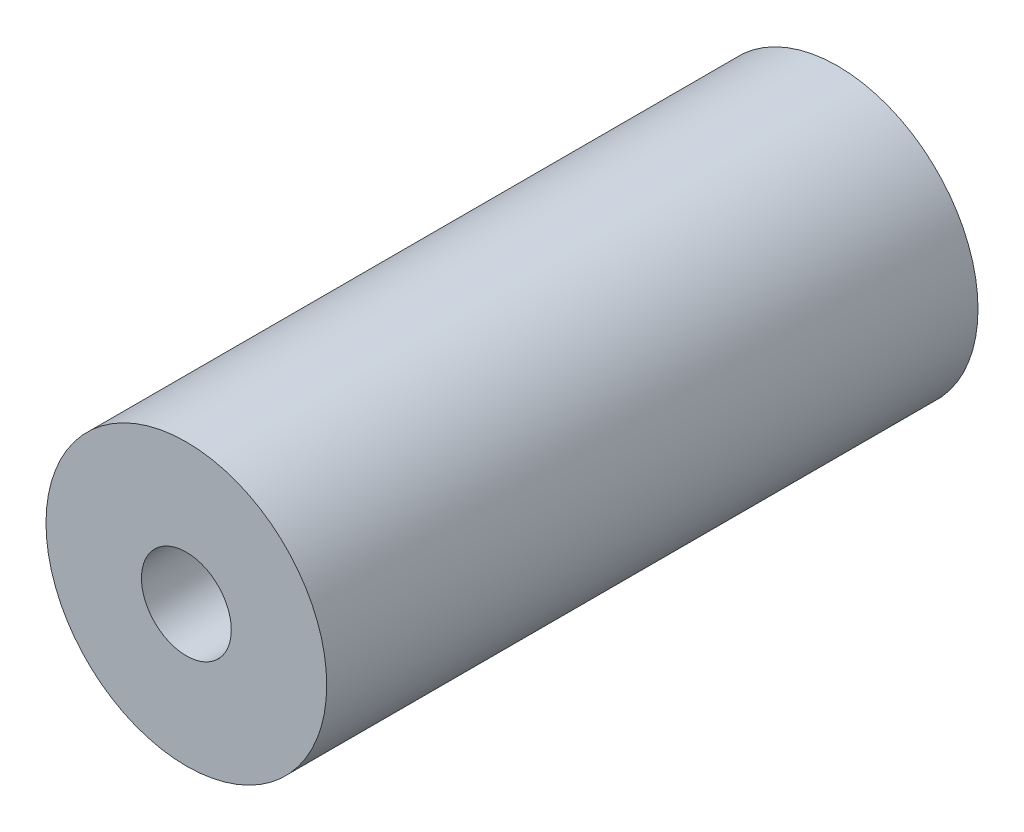
ISO-10303-21;
HEADER;
FILE_DESCRIPTION(('STEP AP214'),'2;1');
FILE_NAME('part.step','',(''),(''),'','','');
FILE_SCHEMA(('AUTOMOTIVE_DESIGN { 1 0 10303 214 1 1 1 1 }'));
ENDSEC;
DATA;
#1=APPLICATION_CONTEXT('core data for automotive mechanical design processes');
#2=APPLICATION_PROTOCOL_DEFINITION('international standard','automotive_design',2000,#1);
#3=PRODUCT_CONTEXT('',#1,'mechanical');
#4=PRODUCT('Part','Part','',(#3));
#5=PRODUCT_RELATED_PRODUCT_CATEGORY('part','',(#4));
#6=PRODUCT_DEFINITION_FORMATION('','',#4);
#7=PRODUCT_DEFINITION_CONTEXT('part definition',#1,'design');
#8=PRODUCT_DEFINITION('design','',#6,#7);
#9=PRODUCT_DEFINITION_SHAPE('','',#8);
#10=(LENGTH_UNIT() NAMED_UNIT(*) SI_UNIT(.MILLI.,.METRE.));
#11=(NAMED_UNIT(*) PLANE_ANGLE_UNIT() SI_UNIT($,.RADIAN.));
#12=(NAMED_UNIT(*) SI_UNIT($,.STERADIAN.) SOLID_ANGLE_UNIT());
#13=UNCERTAINTY_MEASURE_WITH_UNIT(LENGTH_MEASURE(1.E-05),#10,'distance_accuracy_value','');
#14=(GEOMETRIC_REPRESENTATION_CONTEXT(3) GLOBAL_UNCERTAINTY_ASSIGNED_CONTEXT((#13)) GLOBAL_UNIT_ASSIGNED_CONTEXT((#10,
#11,#12)) REPRESENTATION_CONTEXT('',''));
#15=CARTESIAN_POINT('',(0.,0.,0.));
#16=DIRECTION('',(0.,0.,1.));
#17=DIRECTION('',(1.,0.,0.));
#18=AXIS2_PLACEMENT_3D('',#15,#16,#17);
#19=CARTESIAN_POINT('',(0.,0.,-29.));
#20=DIRECTION('',(0.,0.,1.));
#21=DIRECTION('',(1.,0.,0.));
#22=AXIS2_PLACEMENT_3D('',#19,#20,#21);
#23=CYLINDRICAL_SURFACE('',#22,12.5);
#24=CARTESIAN_POINT('',(0.,0.,-29.));
#25=DIRECTION('',(0.,0.,1.));
#26=DIRECTION('',(1.,0.,0.));
#27=AXIS2_PLACEMENT_3D('',#24,#25,#26);
#28=CIRCLE('',#27,12.5);
#29=CARTESIAN_POINT('',(12.5,0.,-29.));
#30=VERTEX_POINT('',#29);
#31=EDGE_CURVE('E10',#30,#30,#28,.T.);
#32=CARTESIAN_POINT('',(0.,0.,29.));
#33=DIRECTION('',(0.,0.,1.));
#34=DIRECTION('',(1.,0.,0.));
#35=AXIS2_PLACEMENT_3D('',#32,#33,#34);
#36=CIRCLE('',#35,12.5);
#37=CARTESIAN_POINT('',(12.5,0.,29.));
#38=VERTEX_POINT('',#37);
#39=EDGE_CURVE('E46',#38,#38,#36,.T.);
#40=CARTESIAN_POINT('',(12.5,0.,-29.));
#41=CARTESIAN_POINT('',(12.5,0.,-28.3958333333333));
#42=CARTESIAN_POINT('',(12.5,0.,-27.7916666666667));
#43=CARTESIAN_POINT('',(12.5,0.,-26.5833333333333));
#44=CARTESIAN_POINT('',(12.5,0.,-25.9791666666667));
#45=CARTESIAN_POINT('',(12.5,0.,-24.7708333333333));
#46=CARTESIAN_POINT('',(12.5,0.,-24.1666666666667));
#47=CARTESIAN_POINT('',(12.5,0.,-22.9583333333333));
#48=CARTESIAN_POINT('',(12.5,0.,-22.3541666666667));
#49=CARTESIAN_POINT('',(12.5,0.,-21.1458333333333));
#50=CARTESIAN_POINT('',(12.5,0.,-20.5416666666667));
#51=CARTESIAN_POINT('',(12.5,0.,-19.3333333333333));
#52=CARTESIAN_POINT('',(12.5,0.,-18.7291666666667));
#53=CARTESIAN_POINT('',(12.5,0.,-17.5208333333333));
#54=CARTESIAN_POINT('',(12.5,0.,-16.9166666666667));
#55=CARTESIAN_POINT('',(12.5,0.,-15.7083333333333));
#56=CARTESIAN_POINT('',(12.5,0.,-15.1041666666667));
#57=CARTESIAN_POINT('',(12.5,0.,-13.8958333333333));
#58=CARTESIAN_POINT('',(12.5,0.,-13.2916666666667));
#59=CARTESIAN_POINT('',(12.5,0.,-12.0833333333333));
#60=CARTESIAN_POINT('',(12.5,0.,-11.4791666666667));
#61=CARTESIAN_POINT('',(12.5,0.,-10.2708333333333));
#62=CARTESIAN_POINT('',(12.5,0.,-9.66666666666667));
#63=CARTESIAN_POINT('',(12.5,0.,-8.45833333333333));
#64=CARTESIAN_POINT('',(12.5,0.,-7.85416666666667));
#65=CARTESIAN_POINT('',(12.5,0.,-6.64583333333333));
#66=CARTESIAN_POINT('',(12.5,0.,-6.04166666666667));
#67=CARTESIAN_POINT('',(12.5,0.,-4.83333333333333));
#68=CARTESIAN_POINT('',(12.5,0.,-4.22916666666667));
#69=CARTESIAN_POINT('',(12.5,0.,-3.02083333333333));
#70=CARTESIAN_POINT('',(12.5,0.,-2.41666666666667));
#71=CARTESIAN_POINT('',(12.5,0.,-1.20833333333333));
#72=CARTESIAN_POINT('',(12.5,0.,-0.604166666666667));
#73=CARTESIAN_POINT('',(12.5,0.,0.604166666666667));
#74=CARTESIAN_POINT('',(12.5,0.,1.20833333333333));
#75=CARTESIAN_POINT('',(12.5,0.,2.41666666666667));
#76=CARTESIAN_POINT('',(12.5,0.,3.02083333333333));
#77=CARTESIAN_POINT('',(12.5,0.,4.22916666666667));
#78=CARTESIAN_POINT('',(12.5,0.,4.83333333333333));
#79=CARTESIAN_POINT('',(12.5,0.,6.04166666666666));
#80=CARTESIAN_POINT('',(12.5,0.,6.64583333333333));
#81=CARTESIAN_POINT('',(12.5,0.,7.85416666666666));
#82=CARTESIAN_POINT('',(12.5,0.,8.45833333333333));
#83=CARTESIAN_POINT('',(12.5,0.,9.66666666666667));
#84=CARTESIAN_POINT('',(12.5,0.,10.2708333333333));
#85=CARTESIAN_POINT('',(12.5,0.,11.4791666666667));
#86=CARTESIAN_POINT('',(12.5,0.,12.0833333333333));
#87=CARTESIAN_POINT('',(12.5,0.,13.2916666666667));
#88=CARTESIAN_POINT('',(12.5,0.,13.8958333333333));
#89=CARTESIAN_POINT('',(12.5,0.,15.1041666666667));
#90=CARTESIAN_POINT('',(12.5,0.,15.7083333333333));
#91=CARTESIAN_POINT('',(12.5,0.,16.9166666666667));
#92=CARTESIAN_POINT('',(12.5,0.,17.5208333333333));
#93=CARTESIAN_POINT('',(12.5,0.,18.7291666666667));
#94=CARTESIAN_POINT('',(12.5,0.,19.3333333333333));
#95=CARTESIAN_POINT('',(12.5,0.,20.5416666666667));
#96=CARTESIAN_POINT('',(12.5,0.,21.1458333333333));
#97=CARTESIAN_POINT('',(12.5,0.,22.3541666666667));
#98=CARTESIAN_POINT('',(12.5,0.,22.9583333333333));
#99=CARTESIAN_POINT('',(12.5,0.,24.1666666666667));
#100=CARTESIAN_POINT('',(12.5,0.,24.7708333333333));
#101=CARTESIAN_POINT('',(12.5,0.,25.9791666666667));
#102=CARTESIAN_POINT('',(12.5,0.,26.5833333333333));
#103=CARTESIAN_POINT('',(12.5,0.,27.7916666666667));
#104=CARTESIAN_POINT('',(12.5,0.,28.3958333333333));
#105=CARTESIAN_POINT('',(12.5,0.,29.));
#106=B_SPLINE_CURVE_WITH_KNOTS('',3,(#40,#41,#42,#43,#44,#45,#46,#47,#48,#49,#50,#51,#52,#53,
#54,#55,#56,#57,#58,#59,#60,#61,#62,#63,#64,#65,#66,#67,#68,#69,#70,#71,#72,#73,#74,#75,#76,#77,
#78,#79,#80,#81,#82,#83,#84,#85,#86,#87,#88,#89,#90,#91,#92,#93,#94,#95,#96,#97,#98,#99,#100,
#101,#102,#103,#104,#105),.UNSPECIFIED.,.F.,.F.,(4,2,2,2,2,2,2,2,2,2,2,2,2,2,2,2,2,2,2,2,2,2,2,
2,2,2,2,2,2,2,2,2,4),(0.,1.8125,3.625,5.4375,7.25,9.0625,10.875,12.6875,14.5,16.3125,18.125,
19.9375,21.75,23.5625,25.375,27.1875,29.,30.8125,32.625,34.4375,36.25,38.0625,39.875,41.6875,
43.5,45.3125,47.125,48.9375,50.75,52.5625,54.375,56.1875,58.),.UNSPECIFIED.);
#107=EDGE_CURVE('BSEAM43',#30,#38,#106,.T.);
#108=ORIENTED_EDGE('',*,*,#31,.T.);
#109=ORIENTED_EDGE('',*,*,#39,.F.);
#110=ORIENTED_EDGE('',*,*,#107,.T.);
#111=ORIENTED_EDGE('',*,*,#107,.F.);
#112=EDGE_LOOP('',(#108,#110,#109,#111));
#113=FACE_BOUND('',#112,.T.);
#114=ADVANCED_FACE('F43',(#113),#23,.T.);
#115=CARTESIAN_POINT('',(0.,0.,-29.));
#116=DIRECTION('',(0.,0.,1.));
#117=DIRECTION('',(1.,0.,0.));
#118=AXIS2_PLACEMENT_3D('',#115,#116,#117);
#119=PLANE('',#118);
#120=CARTESIAN_POINT('',(0.,0.,-29.));
#121=DIRECTION('',(0.,0.,1.));
#122=DIRECTION('',(1.,0.,0.));
#123=AXIS2_PLACEMENT_3D('',#120,#121,#122);
#124=CIRCLE('',#123,4.);
#125=CARTESIAN_POINT('',(4.,0.,-29.));
#126=VERTEX_POINT('',#125);
#127=EDGE_CURVE('E55',#126,#126,#124,.T.);
#128=ORIENTED_EDGE('',*,*,#127,.T.);
#129=EDGE_LOOP('',(#128));
#130=FACE_BOUND('',#129,.T.);
#131=ORIENTED_EDGE('',*,*,#31,.F.);
#132=EDGE_LOOP('',(#131));
#133=FACE_BOUND('',#132,.T.);
#134=ADVANCED_FACE('F71',(#130,#133),#119,.F.);
#135=CARTESIAN_POINT('',(0.,0.,29.));
#136=DIRECTION('',(0.,0.,1.));
#137=DIRECTION('',(1.,0.,0.));
#138=AXIS2_PLACEMENT_3D('',#135,#136,#137);
#139=PLANE('',#138);
#140=CARTESIAN_POINT('',(0.,0.,29.));
#141=DIRECTION('',(0.,0.,1.));
#142=DIRECTION('',(1.,0.,0.));
#143=AXIS2_PLACEMENT_3D('',#140,#141,#142);
#144=CIRCLE('',#143,4.);
#145=CARTESIAN_POINT('',(4.,0.,29.));
#146=VERTEX_POINT('',#145);
#147=EDGE_CURVE('E60',#146,#146,#144,.T.);
#148=ORIENTED_EDGE('',*,*,#147,.F.);
#149=EDGE_LOOP('',(#148));
#150=FACE_BOUND('',#149,.T.);
#151=ORIENTED_EDGE('',*,*,#39,.T.);
#152=EDGE_LOOP('',(#151));
#153=FACE_BOUND('',#152,.T.);
#154=ADVANCED_FACE('F68',(#150,#153),#139,.T.);
#155=CARTESIAN_POINT('',(0.,0.,-41.));
#156=DIRECTION('',(0.,0.,1.));
#157=DIRECTION('',(1.,0.,0.));
#158=AXIS2_PLACEMENT_3D('',#155,#156,#157);
#159=CYLINDRICAL_SURFACE('',#158,4.);
#160=ORIENTED_EDGE('',*,*,#147,.T.);
#161=EDGE_LOOP('',(#160));
#162=FACE_BOUND('',#161,.T.);
#163=ORIENTED_EDGE('',*,*,#127,.F.);
#164=EDGE_LOOP('',(#163));
#165=FACE_BOUND('',#164,.T.);
#166=ADVANCED_FACE('F65',(#162,#165),#159,.F.);
#167=CLOSED_SHELL('',(#114,#134,#154,#166));
#168=MANIFOLD_SOLID_BREP('B2',#167);
#169=ADVANCED_BREP_SHAPE_REPRESENTATION('',(#18,#168),#14);
#170=SHAPE_DEFINITION_REPRESENTATION(#9,#169);
ENDSEC;
END-ISO-10303-21;
